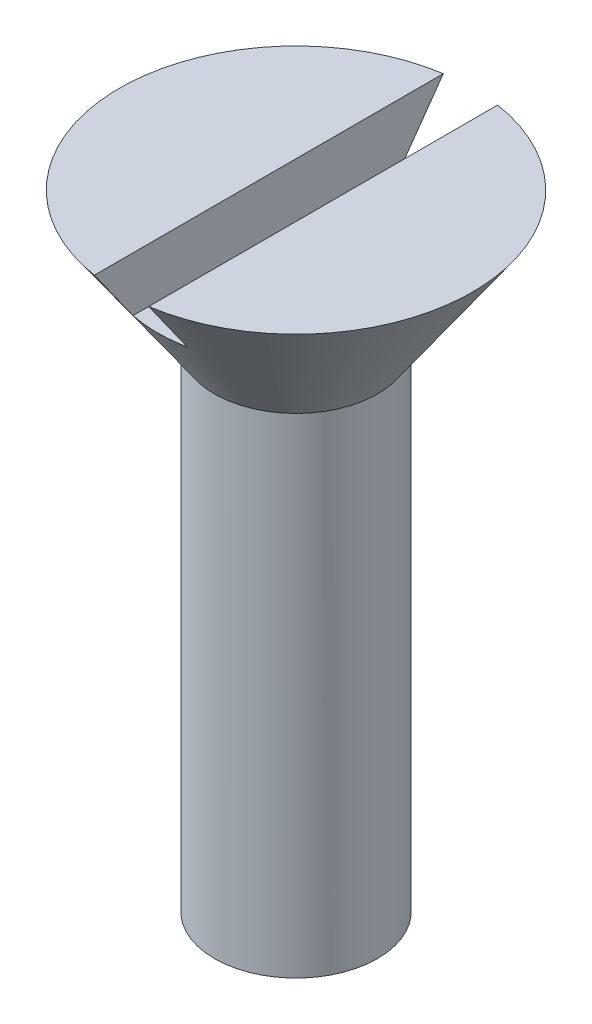
ISO-10303-21;
HEADER;
FILE_DESCRIPTION(('STEP AP214'),'2;1');
FILE_NAME('part.step','',(''),(''),'','','');
FILE_SCHEMA(('AUTOMOTIVE_DESIGN { 1 0 10303 214 1 1 1 1 }'));
ENDSEC;
DATA;
#1=APPLICATION_CONTEXT('core data for automotive mechanical design processes');
#2=APPLICATION_PROTOCOL_DEFINITION('international standard','automotive_design',2000,#1);
#3=PRODUCT_CONTEXT('',#1,'mechanical');
#4=PRODUCT('Part','Part','',(#3));
#5=PRODUCT_RELATED_PRODUCT_CATEGORY('part','',(#4));
#6=PRODUCT_DEFINITION_FORMATION('','',#4);
#7=PRODUCT_DEFINITION_CONTEXT('part definition',#1,'design');
#8=PRODUCT_DEFINITION('design','',#6,#7);
#9=PRODUCT_DEFINITION_SHAPE('','',#8);
#10=(LENGTH_UNIT() NAMED_UNIT(*) SI_UNIT(.MILLI.,.METRE.));
#11=(NAMED_UNIT(*) PLANE_ANGLE_UNIT() SI_UNIT($,.RADIAN.));
#12=(NAMED_UNIT(*) SI_UNIT($,.STERADIAN.) SOLID_ANGLE_UNIT());
#13=UNCERTAINTY_MEASURE_WITH_UNIT(LENGTH_MEASURE(1.E-05),#10,'distance_accuracy_value','');
#14=(GEOMETRIC_REPRESENTATION_CONTEXT(3) GLOBAL_UNCERTAINTY_ASSIGNED_CONTEXT((#13)) GLOBAL_UNIT_ASSIGNED_CONTEXT((#10,
#11,#12)) REPRESENTATION_CONTEXT('',''));
#15=CARTESIAN_POINT('',(0.,0.,0.));
#16=DIRECTION('',(0.,0.,1.));
#17=DIRECTION('',(1.,0.,0.));
#18=AXIS2_PLACEMENT_3D('',#15,#16,#17);
#19=CARTESIAN_POINT('',(-2.81025203108243E-13,23.0000000000002,0.));
#20=DIRECTION('',(0.,1.,0.));
#21=DIRECTION('',(0.,0.,1.00000000000004));
#22=AXIS2_PLACEMENT_3D('',#19,#20,#21);
#23=PLANE('',#22);
#24=CARTESIAN_POINT('',(-2.81025203108243E-13,23.0000000000002,0.));
#25=DIRECTION('',(0.,-1.,0.));
#26=DIRECTION('',(0.,0.,-1.00000000000004));
#27=AXIS2_PLACEMENT_3D('',#24,#25,#26);
#28=CIRCLE('',#27,6.5);
#29=CARTESIAN_POINT('',(0.999999999999873,22.9999999999998,-6.42261628933285));
#30=VERTEX_POINT('',#29);
#31=CARTESIAN_POINT('',(0.99999999999982,23.0000000000001,6.42261628933277));
#32=VERTEX_POINT('',#31);
#33=EDGE_CURVE('E164',#30,#32,#28,.T.);
#34=ORIENTED_EDGE('',*,*,#33,.F.);
#35=DIRECTION('',(0.,0.,1.00000000000004));
#36=VECTOR('',#35,1.);
#37=CARTESIAN_POINT('',(0.999999999999914,22.9999999999998,-6.50000000000018));
#38=LINE('',#37,#36);
#39=EDGE_CURVE('E165',#30,#32,#38,.T.);
#40=ORIENTED_EDGE('',*,*,#39,.T.);
#41=EDGE_LOOP('',(#34,#40));
#42=FACE_BOUND('',#41,.T.);
#43=ADVANCED_FACE('F42',(#42),#23,.T.);
#44=CARTESIAN_POINT('',(-2.63677968348475E-13,18.0000000000002,0.));
#45=DIRECTION('',(0.,1.,0.));
#46=DIRECTION('',(0.,0.,1.00000000000004));
#47=AXIS2_PLACEMENT_3D('',#44,#45,#46);
#48=CONICAL_SURFACE('',#47,3.,0.610725964389208);
#49=CARTESIAN_POINT('',(-2.63677968348475E-13,18.0000000000002,0.));
#50=DIRECTION('',(0.,-1.,0.));
#51=DIRECTION('',(0.,0.,-1.00000000000004));
#52=AXIS2_PLACEMENT_3D('',#49,#50,#51);
#53=CIRCLE('',#52,3.);
#54=CARTESIAN_POINT('',(-2.63677968348475E-13,18.0000000000002,-3.00000000000011));
#55=VERTEX_POINT('',#54);
#56=EDGE_CURVE('E123',#55,#55,#53,.T.);
#57=ORIENTED_EDGE('',*,*,#56,.F.);
#58=EDGE_LOOP('',(#57));
#59=FACE_BOUND('',#58,.T.);
#60=ORIENTED_EDGE('',*,*,#33,.T.);
#61=CARTESIAN_POINT('',(0.999999999999762,23.0007000000001,6.42311219270711));
#62=CARTESIAN_POINT('',(0.999999999999822,22.7495970267895,6.245215075472));
#63=CARTESIAN_POINT('',(0.999999999999847,22.4985696512453,6.06721105785791));
#64=CARTESIAN_POINT('',(0.999999999999865,21.9967145652647,5.71088793330959));
#65=CARTESIAN_POINT('',(0.999999999999859,21.7458868685891,5.53256880699677));
#66=CARTESIAN_POINT('',(0.999999999999854,21.2437528268521,5.17499647886678));
#67=CARTESIAN_POINT('',(0.999999999999856,20.9924473312291,4.99574208349859));
#68=CARTESIAN_POINT('',(0.999999999999857,20.4902413541187,4.63669913452835));
#69=CARTESIAN_POINT('',(0.999999999999857,20.2393408489023,4.4569106141147));
#70=CARTESIAN_POINT('',(0.999999999999856,19.6793343205794,4.05434246098939));
#71=CARTESIAN_POINT('',(0.999999999999856,19.3703707421652,3.83136424535546));
#72=CARTESIAN_POINT('',(0.999999999999856,18.9079325230414,3.49544297230492));
#73=CARTESIAN_POINT('',(0.999999999999856,18.7539384889381,3.38321524822247));
#74=CARTESIAN_POINT('',(0.999999999999857,18.4464223877757,3.15811915839247));
#75=CARTESIAN_POINT('',(0.999999999999857,18.292900313975,3.04525080186202));
#76=CARTESIAN_POINT('',(0.999999999999856,17.9868986347019,2.81893473483292));
#77=CARTESIAN_POINT('',(0.999999999999855,17.8344173577844,2.70548928810699));
#78=CARTESIAN_POINT('',(0.999999999999859,17.5303694464942,2.47735955209779));
#79=CARTESIAN_POINT('',(0.999999999999864,17.3788028662485,2.36267519060114));
#80=CARTESIAN_POINT('',(0.999999999999849,17.0771082256201,2.13153400820366));
#81=CARTESIAN_POINT('',(0.999999999999828,16.9269796522935,2.01507786083143));
#82=CARTESIAN_POINT('',(0.999999999999872,16.703505674841,1.83823431248952));
#83=CARTESIAN_POINT('',(0.999999999999899,16.6293043941638,1.77892951008016));
#84=CARTESIAN_POINT('',(0.999999999999815,16.4816676325265,1.65937552484641));
#85=CARTESIAN_POINT('',(0.999999999999704,16.40823212809,1.59912637111536));
#86=CARTESIAN_POINT('',(0.999999999999748,16.2863402663754,1.49735496061017));
#87=CARTESIAN_POINT('',(0.999999999999828,16.237596683396,1.45617701216028));
#88=CARTESIAN_POINT('',(0.999999999999886,16.140704069837,1.37311830533828));
#89=CARTESIAN_POINT('',(0.999999999999865,16.0925550853482,1.33123749306915));
#90=CARTESIAN_POINT('',(0.999999999999849,15.9968522265241,1.2464478382605));
#91=CARTESIAN_POINT('',(0.999999999999855,15.9493011916315,1.2035357817196));
#92=CARTESIAN_POINT('',(0.999999999999859,15.8552341085013,1.11660199553972));
#93=CARTESIAN_POINT('',(0.999999999999856,15.8087178925227,1.07258044824983));
#94=CARTESIAN_POINT('',(0.999999999999857,15.7182821547125,0.984258875571537));
#95=CARTESIAN_POINT('',(0.999999999999861,15.6743265549751,0.939995978319291));
#96=CARTESIAN_POINT('',(0.999999999999853,15.5882925175198,0.849685965186024));
#97=CARTESIAN_POINT('',(0.999999999999842,15.5462135779954,0.8036393324927));
#98=CARTESIAN_POINT('',(0.999999999999871,15.4650014202045,0.709408627074445));
#99=CARTESIAN_POINT('',(0.999999999999911,15.4258542236833,0.661236704334702));
#100=CARTESIAN_POINT('',(0.999999999999803,15.3517439911946,0.561804744039411));
#101=CARTESIAN_POINT('',(0.999999999999655,15.316773462948,0.510550491890698));
#102=CARTESIAN_POINT('',(0.999999999999766,15.2723815775397,0.435811432213011));
#103=CARTESIAN_POINT('',(0.999999999999834,15.2601609653405,0.413994672182362));
#104=CARTESIAN_POINT('',(0.999999999999879,15.2370524514215,0.369660988832838));
#105=CARTESIAN_POINT('',(0.999999999999856,15.2261650220272,0.347143820893127));
#106=CARTESIAN_POINT('',(0.999999999999858,15.1959967097746,0.278664441259112));
#107=CARTESIAN_POINT('',(0.999999999999956,15.1790913572171,0.231583649581693));
#108=CARTESIAN_POINT('',(0.999999999999962,15.156474191814,0.143751659910715));
#109=CARTESIAN_POINT('',(0.999999999999901,15.1492949960585,0.103387133416517));
#110=CARTESIAN_POINT('',(0.999999999999813,15.1420251335172,0.0219594036923483));
#111=CARTESIAN_POINT('',(0.999999999999786,15.1419395222412,-0.0191042769698694));
#112=CARTESIAN_POINT('',(0.999999999999807,15.1488794860039,-0.100503321516507));
#113=CARTESIAN_POINT('',(0.999999999999854,15.1558892936314,-0.140840098426702));
#114=CARTESIAN_POINT('',(0.99999999999986,15.1759378602438,-0.219934025983465));
#115=CARTESIAN_POINT('',(0.999999999999818,15.1889776976142,-0.258690892735864));
#116=CARTESIAN_POINT('',(0.999999999999816,15.2181196699714,-0.330465253321154));
#117=CARTESIAN_POINT('',(0.999999999999848,15.2337808131756,-0.363667547268302));
#118=CARTESIAN_POINT('',(0.999999999999866,15.2679399414677,-0.42859561901239));
#119=CARTESIAN_POINT('',(0.999999999999851,15.2864404899176,-0.460320028527844));
#120=CARTESIAN_POINT('',(0.999999999999863,15.3256677134381,-0.522585950662275));
#121=CARTESIAN_POINT('',(0.999999999999891,15.346405976725,-0.553120070167328));
#122=CARTESIAN_POINT('',(0.999999999999823,15.3894943578695,-0.612996566707793));
#123=CARTESIAN_POINT('',(0.999999999999728,15.4118437388817,-0.64233947906386));
#124=CARTESIAN_POINT('',(0.999999999999618,15.482165144214,-0.730686952033841));
#125=CARTESIAN_POINT('',(0.999999999999793,15.5321382819678,-0.788092695306662));
#126=CARTESIAN_POINT('',(0.999999999999921,15.635263930678,-0.899994752825755));
#127=CARTESIAN_POINT('',(0.999999999999874,15.6884192595792,-0.954488405025216));
#128=CARTESIAN_POINT('',(0.99999999999984,15.7969381879699,-1.06149306115462));
#129=CARTESIAN_POINT('',(0.999999999999852,15.8523069197779,-1.11399883295352));
#130=CARTESIAN_POINT('',(0.999999999999861,15.9644830297157,-1.21745270602289));
#131=CARTESIAN_POINT('',(0.999999999999858,16.0212905828747,-1.2684006161031));
#132=CARTESIAN_POINT('',(0.999999999999856,16.1363688393034,-1.36949512242312));
#133=CARTESIAN_POINT('',(0.999999999999858,16.1946473264691,-1.41963282838059));
#134=CARTESIAN_POINT('',(0.999999999999856,16.3119884703493,-1.51898955075171));
#135=CARTESIAN_POINT('',(0.999999999999851,16.3710511938011,-1.56820848811067));
#136=CARTESIAN_POINT('',(0.999999999999863,16.4896685825697,-1.66583472159213));
#137=CARTESIAN_POINT('',(0.99999999999988,16.5492222011486,-1.71424329188757));
#138=CARTESIAN_POINT('',(0.999999999999833,16.6687940686929,-1.81047784179122));
#139=CARTESIAN_POINT('',(0.99999999999977,16.728812301149,-1.85830384194617));
#140=CARTESIAN_POINT('',(0.999999999999689,16.918421840272,-2.00819700899561));
#141=CARTESIAN_POINT('',(0.999999999999812,17.0486812553874,-2.10941865781122));
#142=CARTESIAN_POINT('',(0.999999999999902,17.3103052694948,-2.31042525016903));
#143=CARTESIAN_POINT('',(0.999999999999869,17.4416699031886,-2.41021014833126));
#144=CARTESIAN_POINT('',(0.999999999999845,17.7051781833905,-2.60877175431689));
#145=CARTESIAN_POINT('',(0.999999999999853,17.8373219044045,-2.70754836316457));
#146=CARTESIAN_POINT('',(0.99999999999986,18.1021636306379,-2.90435620432967));
#147=CARTESIAN_POINT('',(0.999999999999858,18.2348616391174,-3.00238743225332));
#148=CARTESIAN_POINT('',(0.999999999999854,18.6338603275342,-3.29586613365331));
#149=CARTESIAN_POINT('',(0.999999999999856,18.900773729101,-3.49048011542737));
#150=CARTESIAN_POINT('',(0.999999999999857,19.4355536928034,-3.87835826017651));
#151=CARTESIAN_POINT('',(0.999999999999857,19.7034201997963,-4.07162249938514));
#152=CARTESIAN_POINT('',(0.999999999999856,20.2234518446102,-4.44551854449074));
#153=CARTESIAN_POINT('',(0.999999999999856,20.4755793856735,-4.62620266343096));
#154=CARTESIAN_POINT('',(0.999999999999856,20.9802329410229,-4.98702305613863));
#155=CARTESIAN_POINT('',(0.999999999999856,21.2327589625616,-5.16715931975583));
#156=CARTESIAN_POINT('',(0.999999999999856,21.7377349680715,-5.52677185493382));
#157=CARTESIAN_POINT('',(0.999999999999857,21.9901845420258,-5.70624870244833));
#158=CARTESIAN_POINT('',(0.999999999999856,22.4952973390635,-6.06489037383142));
#159=CARTESIAN_POINT('',(0.999999999999855,22.747960557581,-6.24405520412984));
#160=CARTESIAN_POINT('',(0.999999999999852,23.0006999999999,-6.42311219270717));
#161=B_SPLINE_CURVE_WITH_KNOTS('',3,(#61,#62,#63,#64,#65,#66,#67,#68,#69,#70,#71,#72,#73,#74,
#75,#76,#77,#78,#79,#80,#81,#82,#83,#84,#85,#86,#87,#88,#89,#90,#91,#92,#93,#94,#95,#96,#97,#98,
#99,#100,#101,#102,#103,#104,#105,#106,#107,#108,#109,#110,#111,#112,#113,#114,#115,#116,#117,
#118,#119,#120,#121,#122,#123,#124,#125,#126,#127,#128,#129,#130,#131,#132,#133,#134,#135,#136,
#137,#138,#139,#140,#141,#142,#143,#144,#145,#146,#147,#148,#149,#150,#151,#152,#153,#154,#155,
#156,#157,#158,#159,#160),.UNSPECIFIED.,.F.,.F.,(4,2,2,2,2,2,2,2,2,2,2,2,2,2,2,2,2,2,2,2,2,2,2,
2,2,2,2,2,2,2,2,2,2,2,2,2,2,2,2,2,2,2,2,2,2,2,2,2,2,4),(0.,0.923201509241173,1.84646192008993,
2.77251707641948,3.6985158470708,4.84157654201926,5.4132247330432,5.98486472022897,
6.55502115896806,7.12521101202595,7.69518927526257,7.98015070767573,8.26510337825441,
8.45652467666825,8.64796072134152,8.84010072326172,9.03220934955089,9.21931349760223,
9.40636731153553,9.59246346677016,9.77822061490562,9.85319794763927,9.92820176727327,
10.0775406581727,10.1999903842997,10.3225273780829,10.4447926671675,10.5670798301291,
10.6770443346272,10.7871087034045,10.8977732132443,11.0083874278571,11.2364917496226,
11.464801142832,11.6936747166945,11.9225762674854,12.1531967152284,12.3838369158942,
12.6140718598639,12.8442986600009,13.3391746463811,13.8340662293546,14.3290059335491,
14.8239485529878,15.8149277270123,16.8058504703305,17.7364058749223,18.6669784163907,
19.5962168450813,20.5254358925288),.UNSPECIFIED.);
#162=CARTESIAN_POINT('',(0.999999999999848,21.0000000000002,5.00099990002018));
#163=VERTEX_POINT('',#162);
#164=EDGE_CURVE('E11',#32,#163,#161,.T.);
#165=ORIENTED_EDGE('',*,*,#164,.T.);
#166=CARTESIAN_POINT('',(-1.6306400674182E-13,21.0000000000002,0.));
#167=DIRECTION('',(0.,1.,0.));
#168=DIRECTION('',(0.,0.,1.00000000000004));
#169=AXIS2_PLACEMENT_3D('',#166,#167,#168);
#170=CIRCLE('',#169,5.1);
#171=CARTESIAN_POINT('',(-1.00000000000017,21.0000000000001,5.00099990002017));
#172=VERTEX_POINT('',#171);
#173=EDGE_CURVE('E58',#163,#172,#170,.F.);
#174=ORIENTED_EDGE('',*,*,#173,.T.);
#175=CARTESIAN_POINT('',(-1.00000000000034,23.0007000000001,6.4231121927072));
#176=CARTESIAN_POINT('',(-1.00000000000031,22.7495970267895,6.24521507547207));
#177=CARTESIAN_POINT('',(-1.0000000000003,22.4985696512454,6.06721105785799));
#178=CARTESIAN_POINT('',(-1.00000000000029,21.9967145652649,5.7108879333097));
#179=CARTESIAN_POINT('',(-1.0000000000003,21.7458868685892,5.53256880699691));
#180=CARTESIAN_POINT('',(-1.0000000000003,21.2437528268524,5.17499647886698));
#181=CARTESIAN_POINT('',(-1.0000000000003,20.9924473312294,4.99574208349882));
#182=CARTESIAN_POINT('',(-1.0000000000003,20.490241354119,4.63669913452864));
#183=CARTESIAN_POINT('',(-1.0000000000003,20.2393408489028,4.45691061411503));
#184=CARTESIAN_POINT('',(-1.0000000000003,19.6793343205799,4.05434246098974));
#185=CARTESIAN_POINT('',(-1.0000000000003,19.3703707421656,3.83136424535579));
#186=CARTESIAN_POINT('',(-1.0000000000003,18.9079325230417,3.49544297230522));
#187=CARTESIAN_POINT('',(-1.0000000000003,18.7539384889384,3.38321524822276));
#188=CARTESIAN_POINT('',(-1.0000000000003,18.446422387776,3.15811915839274));
#189=CARTESIAN_POINT('',(-1.0000000000003,18.2929003139753,3.04525080186227));
#190=CARTESIAN_POINT('',(-1.0000000000003,17.9868986347022,2.81893473483314));
#191=CARTESIAN_POINT('',(-1.0000000000003,17.8344173577846,2.70548928810719));
#192=CARTESIAN_POINT('',(-1.0000000000003,17.5303694464944,2.47735955209795));
#193=CARTESIAN_POINT('',(-1.0000000000003,17.3788028662486,2.36267519060128));
#194=CARTESIAN_POINT('',(-1.00000000000029,17.0771082256202,2.13153400820376));
#195=CARTESIAN_POINT('',(-1.00000000000029,16.9269796522936,2.01507786083151));
#196=CARTESIAN_POINT('',(-1.0000000000003,16.703505674841,1.83823431248956));
#197=CARTESIAN_POINT('',(-1.00000000000031,16.6293043941638,1.77892951008019));
#198=CARTESIAN_POINT('',(-1.00000000000028,16.4816676325264,1.65937552484643));
#199=CARTESIAN_POINT('',(-1.00000000000025,16.4082321280899,1.5991263711154));
#200=CARTESIAN_POINT('',(-1.00000000000026,16.2863402663753,1.49735496061019));
#201=CARTESIAN_POINT('',(-1.00000000000029,16.237596683396,1.45617701216028));
#202=CARTESIAN_POINT('',(-1.00000000000031,16.1407040698369,1.37311830533827));
#203=CARTESIAN_POINT('',(-1.0000000000003,16.0925550853481,1.33123749306914));
#204=CARTESIAN_POINT('',(-1.00000000000029,15.996852226524,1.2464478382605));
#205=CARTESIAN_POINT('',(-1.0000000000003,15.9493011916315,1.2035357817196));
#206=CARTESIAN_POINT('',(-1.0000000000003,15.8552341085012,1.11660199553972));
#207=CARTESIAN_POINT('',(-1.0000000000003,15.8087178925226,1.07258044824983));
#208=CARTESIAN_POINT('',(-1.0000000000003,15.7182821547124,0.984258875571557));
#209=CARTESIAN_POINT('',(-1.00000000000029,15.674326554975,0.939995978319322));
#210=CARTESIAN_POINT('',(-1.0000000000003,15.5882925175198,0.849685965186068));
#211=CARTESIAN_POINT('',(-1.00000000000031,15.5462135779954,0.803639332492745));
#212=CARTESIAN_POINT('',(-1.00000000000028,15.4650014202044,0.709408627074518));
#213=CARTESIAN_POINT('',(-1.00000000000025,15.4258542236832,0.661236704334803));
#214=CARTESIAN_POINT('',(-1.00000000000035,15.3517439911946,0.561804744039418));
#215=CARTESIAN_POINT('',(-1.00000000000049,15.3167734629482,0.510550491890584));
#216=CARTESIAN_POINT('',(-1.00000000000039,15.2723815775397,0.435811432212943));
#217=CARTESIAN_POINT('',(-1.00000000000032,15.2601609653405,0.413994672182331));
#218=CARTESIAN_POINT('',(-1.00000000000027,15.2370524514213,0.369660988832832));
#219=CARTESIAN_POINT('',(-1.00000000000028,15.226165022027,0.347143820893108));
#220=CARTESIAN_POINT('',(-1.00000000000033,15.1959967097745,0.278664441259039));
#221=CARTESIAN_POINT('',(-1.00000000000039,15.1790913572172,0.231583649581565));
#222=CARTESIAN_POINT('',(-1.00000000000038,15.156474191814,0.143751659910573));
#223=CARTESIAN_POINT('',(-1.00000000000033,15.1492949960584,0.103387133416404));
#224=CARTESIAN_POINT('',(-1.00000000000026,15.142025133517,0.0219594036922712));
#225=CARTESIAN_POINT('',(-1.00000000000024,15.1419395222412,-0.0191042769699398));
#226=CARTESIAN_POINT('',(-1.00000000000023,15.1488794860039,-0.100503321516598));
#227=CARTESIAN_POINT('',(-1.00000000000025,15.1558892936313,-0.140840098426819));
#228=CARTESIAN_POINT('',(-1.00000000000034,15.1759378602437,-0.219934025983579));
#229=CARTESIAN_POINT('',(-1.00000000000042,15.1889776976142,-0.25869089273595));
#230=CARTESIAN_POINT('',(-1.0000000000004,15.2181196699714,-0.330465253321245));
#231=CARTESIAN_POINT('',(-1.00000000000032,15.2337808131756,-0.36366754726842));
#232=CARTESIAN_POINT('',(-1.00000000000027,15.2679399414676,-0.428595619012508));
#233=CARTESIAN_POINT('',(-1.00000000000029,15.2864404899175,-0.460320028527936));
#234=CARTESIAN_POINT('',(-1.0000000000003,15.325667713438,-0.522585950662345));
#235=CARTESIAN_POINT('',(-1.00000000000029,15.3464059767249,-0.553120070167403));
#236=CARTESIAN_POINT('',(-1.0000000000003,15.3894943578694,-0.612996566707813));
#237=CARTESIAN_POINT('',(-1.00000000000032,15.4118437388817,-0.64233947906382));
#238=CARTESIAN_POINT('',(-1.00000000000034,15.4821651442141,-0.730686952033741));
#239=CARTESIAN_POINT('',(-1.00000000000031,15.5321382819678,-0.788092695306672));
#240=CARTESIAN_POINT('',(-1.00000000000029,15.6352639306779,-0.899994752825847));
#241=CARTESIAN_POINT('',(-1.00000000000029,15.6884192595791,-0.954488405025281));
#242=CARTESIAN_POINT('',(-1.0000000000003,15.7969381879699,-1.06149306115466));
#243=CARTESIAN_POINT('',(-1.0000000000003,15.8523069197778,-1.11399883295356));
#244=CARTESIAN_POINT('',(-1.0000000000003,15.9644830297156,-1.21745270602293));
#245=CARTESIAN_POINT('',(-1.0000000000003,16.0212905828746,-1.26840061610313));
#246=CARTESIAN_POINT('',(-1.0000000000003,16.1363688393033,-1.36949512242314));
#247=CARTESIAN_POINT('',(-1.0000000000003,16.1946473264691,-1.4196328283806));
#248=CARTESIAN_POINT('',(-1.0000000000003,16.3119884703492,-1.51898955075171));
#249=CARTESIAN_POINT('',(-1.00000000000029,16.3710511938011,-1.56820848811066));
#250=CARTESIAN_POINT('',(-1.0000000000003,16.4896685825696,-1.66583472159213));
#251=CARTESIAN_POINT('',(-1.00000000000031,16.5492222011485,-1.71424329188758));
#252=CARTESIAN_POINT('',(-1.00000000000028,16.6687940686929,-1.81047784179119));
#253=CARTESIAN_POINT('',(-1.00000000000025,16.7288123011489,-1.85830384194608));
#254=CARTESIAN_POINT('',(-1.00000000000021,16.918421840272,-2.00819700899545));
#255=CARTESIAN_POINT('',(-1.00000000000027,17.0486812553873,-2.10941865781116));
#256=CARTESIAN_POINT('',(-1.00000000000032,17.3103052694947,-2.31042525016904));
#257=CARTESIAN_POINT('',(-1.0000000000003,17.4416699031885,-2.41021014833123));
#258=CARTESIAN_POINT('',(-1.00000000000029,17.7051781833904,-2.60877175431683));
#259=CARTESIAN_POINT('',(-1.0000000000003,17.8373219044044,-2.70754836316451));
#260=CARTESIAN_POINT('',(-1.0000000000003,18.1021636306378,-2.90435620432961));
#261=CARTESIAN_POINT('',(-1.0000000000003,18.2348616391173,-3.00238743225326));
#262=CARTESIAN_POINT('',(-1.0000000000003,18.6338603275341,-3.29586613365322));
#263=CARTESIAN_POINT('',(-1.0000000000003,18.9007737291009,-3.49048011542726));
#264=CARTESIAN_POINT('',(-1.0000000000003,19.4355536928032,-3.87835826017637));
#265=CARTESIAN_POINT('',(-1.0000000000003,19.7034201997961,-4.07162249938499));
#266=CARTESIAN_POINT('',(-1.0000000000003,20.22345184461,-4.44551854449058));
#267=CARTESIAN_POINT('',(-1.0000000000003,20.4755793856733,-4.62620266343081));
#268=CARTESIAN_POINT('',(-1.0000000000003,20.9802329410227,-4.98702305613851));
#269=CARTESIAN_POINT('',(-1.00000000000029,21.2327589625614,-5.16715931975572));
#270=CARTESIAN_POINT('',(-1.0000000000003,21.7377349680714,-5.52677185493373));
#271=CARTESIAN_POINT('',(-1.00000000000031,21.9901845420256,-5.70624870244826));
#272=CARTESIAN_POINT('',(-1.00000000000028,22.4952973390634,-6.06489037383138));
#273=CARTESIAN_POINT('',(-1.00000000000025,22.747960557581,-6.24405520412981));
#274=CARTESIAN_POINT('',(-1.00000000000016,23.0006999999999,-6.42311219270714));
#275=B_SPLINE_CURVE_WITH_KNOTS('',3,(#175,#176,#177,#178,#179,#180,#181,#182,#183,#184,#185,
#186,#187,#188,#189,#190,#191,#192,#193,#194,#195,#196,#197,#198,#199,#200,#201,#202,#203,#204,
#205,#206,#207,#208,#209,#210,#211,#212,#213,#214,#215,#216,#217,#218,#219,#220,#221,#222,#223,
#224,#225,#226,#227,#228,#229,#230,#231,#232,#233,#234,#235,#236,#237,#238,#239,#240,#241,#242,
#243,#244,#245,#246,#247,#248,#249,#250,#251,#252,#253,#254,#255,#256,#257,#258,#259,#260,#261,
#262,#263,#264,#265,#266,#267,#268,#269,#270,#271,#272,#273,#274),.UNSPECIFIED.,.F.,.F.,(4,2,2,
2,2,2,2,2,2,2,2,2,2,2,2,2,2,2,2,2,2,2,2,2,2,2,2,2,2,2,2,2,2,2,2,2,2,2,2,2,2,2,2,2,2,2,2,2,2,4),
(0.,0.923201509241077,1.84646192008973,2.7725170764191,3.69851584707025,4.84157654201882,
5.41322473304283,5.98486472022865,6.55502115896785,7.12521101202585,7.69518927526258,
7.98015070767579,8.26510337825452,8.45652467666837,8.64796072134165,8.84010072326183,
9.03220934955099,9.2193134976023,9.40636731153557,9.59246346677022,9.77822061490574,
9.85319794763942,9.92820176727344,10.0775406581729,10.1999903842999,10.3225273780831,
10.4447926671677,10.5670798301293,10.6770443346274,10.7871087034046,10.8977732132444,
11.0083874278572,11.2364917496227,11.4648011428322,11.6936747166946,11.9225762674855,
12.1531967152285,12.3838369158942,12.6140718598639,12.844298660001,13.3391746463811,
13.8340662293547,14.3290059335491,14.8239485529878,15.8149277270122,16.8058504703304,
17.7364058749222,18.6669784163906,19.5962168450813,20.5254358925289),.UNSPECIFIED.);
#276=CARTESIAN_POINT('',(-1.00000000000024,23.0000000000001,6.42261628933282));
#277=VERTEX_POINT('',#276);
#278=EDGE_CURVE('E89',#277,#172,#275,.T.);
#279=ORIENTED_EDGE('',*,*,#278,.F.);
#280=CARTESIAN_POINT('',(-1.00000000000021,22.9999999999998,-6.42261628933284));
#281=VERTEX_POINT('',#280);
#282=EDGE_CURVE('E160',#277,#281,#28,.T.);
#283=ORIENTED_EDGE('',*,*,#282,.T.);
#284=CARTESIAN_POINT('',(-1.00000000000023,20.9999999999998,-5.00099990002031));
#285=VERTEX_POINT('',#284);
#286=EDGE_CURVE('E99',#285,#281,#275,.T.);
#287=ORIENTED_EDGE('',*,*,#286,.F.);
#288=CARTESIAN_POINT('',(0.999999999999879,20.9999999999998,-5.00099990002021));
#289=VERTEX_POINT('',#288);
#290=EDGE_CURVE('E105',#285,#289,#170,.F.);
#291=ORIENTED_EDGE('',*,*,#290,.T.);
#292=EDGE_CURVE('E46',#289,#30,#161,.T.);
#293=ORIENTED_EDGE('',*,*,#292,.T.);
#294=EDGE_LOOP('',(#60,#165,#174,#279,#283,#287,#291,#293));
#295=FACE_BOUND('',#294,.T.);
#296=ADVANCED_FACE('F111',(#59,#295),#48,.T.);
#297=DIRECTION('',(0.,0.,1.00000000000004));
#298=VECTOR('',#297,1.);
#299=CARTESIAN_POINT('',(-1.00000000000021,22.9999999999998,-6.50000000000034));
#300=LINE('',#299,#298);
#301=EDGE_CURVE('E92',#281,#277,#300,.T.);
#302=ORIENTED_EDGE('',*,*,#301,.F.);
#303=ORIENTED_EDGE('',*,*,#282,.F.);
#304=EDGE_LOOP('',(#302,#303));
#305=FACE_BOUND('',#304,.T.);
#306=ADVANCED_FACE('F44',(#305),#23,.T.);
#307=CARTESIAN_POINT('',(0.,-1.73205080756887,0.));
#308=DIRECTION('',(0.,1.,0.));
#309=DIRECTION('',(0.,0.,1.00000000000004));
#310=AXIS2_PLACEMENT_3D('',#307,#308,#309);
#311=CONICAL_SURFACE('',#310,0.,1.0471975511966);
#312=CARTESIAN_POINT('',(0.,0.,0.));
#313=DIRECTION('',(0.,-1.,0.));
#314=DIRECTION('',(0.,0.,-1.00000000000004));
#315=AXIS2_PLACEMENT_3D('',#312,#313,#314);
#316=CIRCLE('',#315,3.);
#317=CARTESIAN_POINT('',(0.,0.,-3.00000000000013));
#318=VERTEX_POINT('',#317);
#319=EDGE_CURVE('E119',#318,#318,#316,.T.);
#320=ORIENTED_EDGE('',*,*,#319,.T.);
#321=EDGE_LOOP('',(#320));
#322=FACE_BOUND('',#321,.T.);
#323=CARTESIAN_POINT('',(0.,-1.73205080756887,0.));
#324=VERTEX_POINT('',#323);
#325=VERTEX_LOOP('',#324);
#326=FACE_BOUND('',#325,.T.);
#327=ADVANCED_FACE('F145',(#322,#326),#311,.T.);
#328=CARTESIAN_POINT('',(-2.63677968348475E-13,18.0000000000002,0.));
#329=DIRECTION('',(0.,-1.,0.));
#330=DIRECTION('',(0.,0.,-1.00000000000004));
#331=AXIS2_PLACEMENT_3D('',#328,#329,#330);
#332=CYLINDRICAL_SURFACE('',#331,3.);
#333=ORIENTED_EDGE('',*,*,#56,.T.);
#334=EDGE_LOOP('',(#333));
#335=FACE_BOUND('',#334,.T.);
#336=ORIENTED_EDGE('',*,*,#319,.F.);
#337=EDGE_LOOP('',(#336));
#338=FACE_BOUND('',#337,.T.);
#339=ADVANCED_FACE('F140',(#335,#338),#332,.T.);
#340=CARTESIAN_POINT('',(0.999999999999859,-1.31838984174237E-13,-6.50000000000029));
#341=DIRECTION('',(-1.00000000000004,0.,0.));
#342=DIRECTION('',(0.,-1.,0.));
#343=AXIS2_PLACEMENT_3D('',#340,#341,#342);
#344=PLANE('',#343);
#345=ORIENTED_EDGE('',*,*,#39,.F.);
#346=ORIENTED_EDGE('',*,*,#292,.F.);
#347=DIRECTION('',(0.,0.,1.00000000000004));
#348=VECTOR('',#347,1.);
#349=CARTESIAN_POINT('',(0.999999999999879,20.9999999999998,-6.50000000000027));
#350=LINE('',#349,#348);
#351=EDGE_CURVE('E108',#289,#163,#350,.T.);
#352=ORIENTED_EDGE('',*,*,#351,.T.);
#353=ORIENTED_EDGE('',*,*,#164,.F.);
#354=EDGE_LOOP('',(#345,#346,#352,#353));
#355=FACE_BOUND('',#354,.T.);
#356=ADVANCED_FACE('F137',(#355),#344,.T.);
#357=CARTESIAN_POINT('',(-2.42861286636753E-13,20.9999999999998,-6.50000000000043));
#358=DIRECTION('',(0.,1.,0.));
#359=DIRECTION('',(0.,0.,1.00000000000004));
#360=AXIS2_PLACEMENT_3D('',#357,#358,#359);
#361=PLANE('',#360);
#362=DIRECTION('',(0.,0.,1.00000000000004));
#363=VECTOR('',#362,1.);
#364=CARTESIAN_POINT('',(-1.0000000000002,20.9999999999998,-6.50000000000032));
#365=LINE('',#364,#363);
#366=EDGE_CURVE('E65',#285,#172,#365,.T.);
#367=ORIENTED_EDGE('',*,*,#366,.T.);
#368=ORIENTED_EDGE('',*,*,#173,.F.);
#369=ORIENTED_EDGE('',*,*,#351,.F.);
#370=ORIENTED_EDGE('',*,*,#290,.F.);
#371=EDGE_LOOP('',(#367,#368,#369,#370));
#372=FACE_BOUND('',#371,.T.);
#373=ADVANCED_FACE('F101',(#372),#361,.T.);
#374=CARTESIAN_POINT('',(-1.0000000000003,-1.31838984174237E-13,-6.50000000000049));
#375=DIRECTION('',(-1.00000000000004,0.,0.));
#376=DIRECTION('',(0.,-1.,0.));
#377=AXIS2_PLACEMENT_3D('',#374,#375,#376);
#378=PLANE('',#377);
#379=ORIENTED_EDGE('',*,*,#278,.T.);
#380=ORIENTED_EDGE('',*,*,#366,.F.);
#381=ORIENTED_EDGE('',*,*,#286,.T.);
#382=ORIENTED_EDGE('',*,*,#301,.T.);
#383=EDGE_LOOP('',(#379,#380,#381,#382));
#384=FACE_BOUND('',#383,.T.);
#385=ADVANCED_FACE('F90',(#384),#378,.F.);
#386=CLOSED_SHELL('',(#43,#296,#306,#327,#339,#356,#373,#385));
#387=MANIFOLD_SOLID_BREP('B2',#386);
#388=ADVANCED_BREP_SHAPE_REPRESENTATION('',(#18,#387),#14);
#389=SHAPE_DEFINITION_REPRESENTATION(#9,#388);
ENDSEC;
END-ISO-10303-21;
